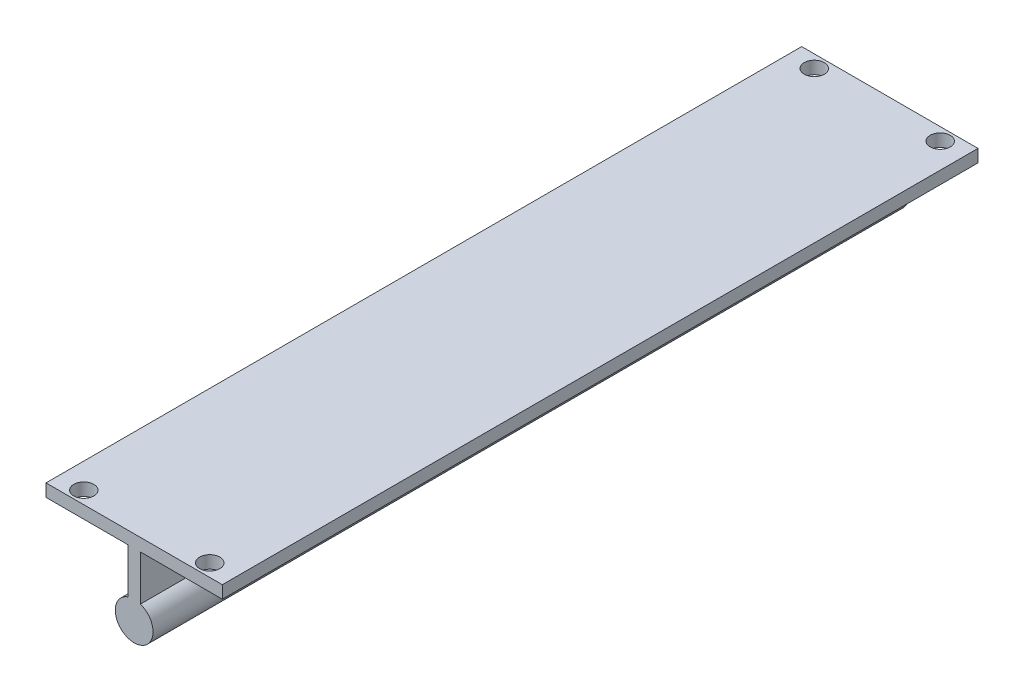
ISO-10303-21;
HEADER;
FILE_DESCRIPTION(('STEP AP214'),'2;1');
FILE_NAME('part.step','',(''),(''),'','','');
FILE_SCHEMA(('AUTOMOTIVE_DESIGN { 1 0 10303 214 1 1 1 1 }'));
ENDSEC;
DATA;
#1=APPLICATION_CONTEXT('core data for automotive mechanical design processes');
#2=APPLICATION_PROTOCOL_DEFINITION('international standard','automotive_design',2000,#1);
#3=PRODUCT_CONTEXT('',#1,'mechanical');
#4=PRODUCT('Part','Part','',(#3));
#5=PRODUCT_RELATED_PRODUCT_CATEGORY('part','',(#4));
#6=PRODUCT_DEFINITION_FORMATION('','',#4);
#7=PRODUCT_DEFINITION_CONTEXT('part definition',#1,'design');
#8=PRODUCT_DEFINITION('design','',#6,#7);
#9=PRODUCT_DEFINITION_SHAPE('','',#8);
#10=(LENGTH_UNIT() NAMED_UNIT(*) SI_UNIT(.MILLI.,.METRE.));
#11=(NAMED_UNIT(*) PLANE_ANGLE_UNIT() SI_UNIT($,.RADIAN.));
#12=(NAMED_UNIT(*) SI_UNIT($,.STERADIAN.) SOLID_ANGLE_UNIT());
#13=UNCERTAINTY_MEASURE_WITH_UNIT(LENGTH_MEASURE(1.E-05),#10,'distance_accuracy_value','');
#14=(GEOMETRIC_REPRESENTATION_CONTEXT(3) GLOBAL_UNCERTAINTY_ASSIGNED_CONTEXT((#13)) GLOBAL_UNIT_ASSIGNED_CONTEXT((#10,
#11,#12)) REPRESENTATION_CONTEXT('',''));
#15=CARTESIAN_POINT('',(0.,0.,0.));
#16=DIRECTION('',(0.,0.,1.));
#17=DIRECTION('',(1.,0.,0.));
#18=AXIS2_PLACEMENT_3D('',#15,#16,#17);
#19=CARTESIAN_POINT('',(0.,0.,300.));
#20=DIRECTION('',(0.,0.,-1.));
#21=DIRECTION('',(-1.,0.,0.));
#22=AXIS2_PLACEMENT_3D('',#19,#20,#21);
#23=CYLINDRICAL_SURFACE('',#22,7.5);
#24=CARTESIAN_POINT('',(0.,0.,0.));
#25=DIRECTION('',(0.,0.,1.));
#26=DIRECTION('',(1.,0.,0.));
#27=AXIS2_PLACEMENT_3D('',#24,#25,#26);
#28=CIRCLE('',#27,7.5);
#29=CARTESIAN_POINT('',(-2.5,7.07106781186548,0.));
#30=VERTEX_POINT('',#29);
#31=CARTESIAN_POINT('',(2.5,7.07106781186548,0.));
#32=VERTEX_POINT('',#31);
#33=EDGE_CURVE('E180',#30,#32,#28,.T.);
#34=ORIENTED_EDGE('',*,*,#33,.T.);
#35=DIRECTION('',(0.,0.,-1.));
#36=VECTOR('',#35,1.);
#37=CARTESIAN_POINT('',(2.5,7.07106781186548,300.));
#38=LINE('',#37,#36);
#39=CARTESIAN_POINT('',(2.5,7.07106781186548,300.));
#40=VERTEX_POINT('',#39);
#41=EDGE_CURVE('E177',#32,#40,#38,.F.);
#42=ORIENTED_EDGE('',*,*,#41,.T.);
#43=CARTESIAN_POINT('',(0.,0.,300.));
#44=DIRECTION('',(0.,0.,1.));
#45=DIRECTION('',(1.,0.,0.));
#46=AXIS2_PLACEMENT_3D('',#43,#44,#45);
#47=CIRCLE('',#46,7.5);
#48=CARTESIAN_POINT('',(-2.5,7.07106781186548,300.));
#49=VERTEX_POINT('',#48);
#50=EDGE_CURVE('E48',#49,#40,#47,.T.);
#51=ORIENTED_EDGE('',*,*,#50,.F.);
#52=DIRECTION('',(0.,0.,-1.));
#53=VECTOR('',#52,1.);
#54=CARTESIAN_POINT('',(-2.5,7.07106781186548,300.));
#55=LINE('',#54,#53);
#56=EDGE_CURVE('E173',#49,#30,#55,.T.);
#57=ORIENTED_EDGE('',*,*,#56,.T.);
#58=EDGE_LOOP('',(#34,#42,#51,#57));
#59=FACE_BOUND('',#58,.T.);
#60=ADVANCED_FACE('F39',(#59),#23,.T.);
#61=CARTESIAN_POINT('',(0.,0.,300.));
#62=DIRECTION('',(0.,0.,1.));
#63=DIRECTION('',(1.,0.,0.));
#64=AXIS2_PLACEMENT_3D('',#61,#62,#63);
#65=PLANE('',#64);
#66=DIRECTION('',(0.,1.,0.));
#67=VECTOR('',#66,1.);
#68=CARTESIAN_POINT('',(2.49999999999999,30.,300.));
#69=LINE('',#68,#67);
#70=CARTESIAN_POINT('',(2.49999999999999,25.,300.));
#71=VERTEX_POINT('',#70);
#72=EDGE_CURVE('E117',#40,#71,#69,.T.);
#73=ORIENTED_EDGE('',*,*,#72,.T.);
#74=DIRECTION('',(1.,0.,0.));
#75=VECTOR('',#74,1.);
#76=CARTESIAN_POINT('',(-35.,25.,300.));
#77=LINE('',#76,#75);
#78=CARTESIAN_POINT('',(35.,25.,300.));
#79=VERTEX_POINT('',#78);
#80=EDGE_CURVE('E131',#71,#79,#77,.T.);
#81=ORIENTED_EDGE('',*,*,#80,.T.);
#82=DIRECTION('',(0.,1.,0.));
#83=VECTOR('',#82,1.);
#84=CARTESIAN_POINT('',(35.,25.,300.));
#85=LINE('',#84,#83);
#86=CARTESIAN_POINT('',(35.,30.,300.));
#87=VERTEX_POINT('',#86);
#88=EDGE_CURVE('E124',#79,#87,#85,.T.);
#89=ORIENTED_EDGE('',*,*,#88,.T.);
#90=DIRECTION('',(-1.,0.,0.));
#91=VECTOR('',#90,1.);
#92=CARTESIAN_POINT('',(-2.5,30.,300.));
#93=LINE('',#92,#91);
#94=CARTESIAN_POINT('',(-35.,30.,300.));
#95=VERTEX_POINT('',#94);
#96=EDGE_CURVE('E107',#87,#95,#93,.T.);
#97=ORIENTED_EDGE('',*,*,#96,.T.);
#98=DIRECTION('',(0.,-1.,0.));
#99=VECTOR('',#98,1.);
#100=CARTESIAN_POINT('',(-35.,30.,300.));
#101=LINE('',#100,#99);
#102=CARTESIAN_POINT('',(-35.,25.,300.));
#103=VERTEX_POINT('',#102);
#104=EDGE_CURVE('E134',#95,#103,#101,.T.);
#105=ORIENTED_EDGE('',*,*,#104,.T.);
#106=CARTESIAN_POINT('',(-2.5,25.,300.));
#107=VERTEX_POINT('',#106);
#108=EDGE_CURVE('E127',#103,#107,#77,.T.);
#109=ORIENTED_EDGE('',*,*,#108,.T.);
#110=DIRECTION('',(0.,-1.,0.));
#111=VECTOR('',#110,1.);
#112=CARTESIAN_POINT('',(-2.5,0.,300.));
#113=LINE('',#112,#111);
#114=EDGE_CURVE('E64',#107,#49,#113,.T.);
#115=ORIENTED_EDGE('',*,*,#114,.T.);
#116=ORIENTED_EDGE('',*,*,#50,.T.);
#117=EDGE_LOOP('',(#73,#81,#89,#97,#105,#109,#115,#116));
#118=FACE_BOUND('',#117,.T.);
#119=ADVANCED_FACE('F130',(#118),#65,.T.);
#120=CARTESIAN_POINT('',(0.,0.,0.));
#121=DIRECTION('',(0.,0.,1.));
#122=DIRECTION('',(1.,0.,0.));
#123=AXIS2_PLACEMENT_3D('',#120,#121,#122);
#124=PLANE('',#123);
#125=DIRECTION('',(0.,1.,0.));
#126=VECTOR('',#125,1.);
#127=CARTESIAN_POINT('',(-2.5,0.,0.));
#128=LINE('',#127,#126);
#129=CARTESIAN_POINT('',(-2.5,25.,0.));
#130=VERTEX_POINT('',#129);
#131=EDGE_CURVE('E159',#30,#130,#128,.T.);
#132=ORIENTED_EDGE('',*,*,#131,.T.);
#133=DIRECTION('',(-1.,0.,0.));
#134=VECTOR('',#133,1.);
#135=CARTESIAN_POINT('',(-35.,25.,0.));
#136=LINE('',#135,#134);
#137=CARTESIAN_POINT('',(-35.,25.,0.));
#138=VERTEX_POINT('',#137);
#139=EDGE_CURVE('E213',#130,#138,#136,.T.);
#140=ORIENTED_EDGE('',*,*,#139,.T.);
#141=DIRECTION('',(0.,1.,0.));
#142=VECTOR('',#141,1.);
#143=CARTESIAN_POINT('',(-35.,30.,0.));
#144=LINE('',#143,#142);
#145=CARTESIAN_POINT('',(-35.,30.,0.));
#146=VERTEX_POINT('',#145);
#147=EDGE_CURVE('E150',#138,#146,#144,.T.);
#148=ORIENTED_EDGE('',*,*,#147,.T.);
#149=DIRECTION('',(1.,0.,0.));
#150=VECTOR('',#149,1.);
#151=CARTESIAN_POINT('',(-2.5,30.,0.));
#152=LINE('',#151,#150);
#153=CARTESIAN_POINT('',(35.,30.,0.));
#154=VERTEX_POINT('',#153);
#155=EDGE_CURVE('E166',#146,#154,#152,.T.);
#156=ORIENTED_EDGE('',*,*,#155,.T.);
#157=DIRECTION('',(0.,-1.,0.));
#158=VECTOR('',#157,1.);
#159=CARTESIAN_POINT('',(35.,25.,0.));
#160=LINE('',#159,#158);
#161=CARTESIAN_POINT('',(35.,25.,0.));
#162=VERTEX_POINT('',#161);
#163=EDGE_CURVE('E125',#154,#162,#160,.T.);
#164=ORIENTED_EDGE('',*,*,#163,.T.);
#165=CARTESIAN_POINT('',(2.49999999999999,25.,0.));
#166=VERTEX_POINT('',#165);
#167=EDGE_CURVE('E56',#162,#166,#136,.T.);
#168=ORIENTED_EDGE('',*,*,#167,.T.);
#169=DIRECTION('',(0.,-1.,0.));
#170=VECTOR('',#169,1.);
#171=CARTESIAN_POINT('',(2.49999999999999,30.,0.));
#172=LINE('',#171,#170);
#173=EDGE_CURVE('E163',#166,#32,#172,.T.);
#174=ORIENTED_EDGE('',*,*,#173,.T.);
#175=ORIENTED_EDGE('',*,*,#33,.F.);
#176=EDGE_LOOP('',(#132,#140,#148,#156,#164,#168,#174,#175));
#177=FACE_BOUND('',#176,.T.);
#178=ADVANCED_FACE('F218',(#177),#124,.F.);
#179=CARTESIAN_POINT('',(2.49999999999999,30.,-30.4138126514911));
#180=DIRECTION('',(1.,0.,0.));
#181=DIRECTION('',(0.,1.,0.));
#182=AXIS2_PLACEMENT_3D('',#179,#180,#181);
#183=PLANE('',#182);
#184=DIRECTION('',(0.,0.,-1.));
#185=VECTOR('',#184,1.);
#186=CARTESIAN_POINT('',(2.49999999999999,25.,-30.4138126514911));
#187=LINE('',#186,#185);
#188=EDGE_CURVE('E156',#71,#166,#187,.T.);
#189=ORIENTED_EDGE('',*,*,#188,.F.);
#190=ORIENTED_EDGE('',*,*,#72,.F.);
#191=ORIENTED_EDGE('',*,*,#41,.F.);
#192=ORIENTED_EDGE('',*,*,#173,.F.);
#193=EDGE_LOOP('',(#189,#190,#191,#192));
#194=FACE_BOUND('',#193,.T.);
#195=ADVANCED_FACE('F235',(#194),#183,.T.);
#196=CARTESIAN_POINT('',(-2.5,0.,-30.4138126514911));
#197=DIRECTION('',(-1.,0.,0.));
#198=DIRECTION('',(0.,0.,1.));
#199=AXIS2_PLACEMENT_3D('',#196,#197,#198);
#200=PLANE('',#199);
#201=DIRECTION('',(0.,0.,1.));
#202=VECTOR('',#201,1.);
#203=CARTESIAN_POINT('',(-2.5,25.,-30.4138126514911));
#204=LINE('',#203,#202);
#205=EDGE_CURVE('E11',#130,#107,#204,.T.);
#206=ORIENTED_EDGE('',*,*,#205,.F.);
#207=ORIENTED_EDGE('',*,*,#131,.F.);
#208=ORIENTED_EDGE('',*,*,#56,.F.);
#209=ORIENTED_EDGE('',*,*,#114,.F.);
#210=EDGE_LOOP('',(#206,#207,#208,#209));
#211=FACE_BOUND('',#210,.T.);
#212=ADVANCED_FACE('F229',(#211),#200,.T.);
#213=CARTESIAN_POINT('',(-2.5,30.,-30.4138126514911));
#214=DIRECTION('',(0.,1.,0.));
#215=DIRECTION('',(0.,0.,1.));
#216=AXIS2_PLACEMENT_3D('',#213,#214,#215);
#217=PLANE('',#216);
#218=CARTESIAN_POINT('',(-25.,30.,295.));
#219=DIRECTION('',(0.,1.,0.));
#220=DIRECTION('',(0.,0.,1.));
#221=AXIS2_PLACEMENT_3D('',#218,#219,#220);
#222=CIRCLE('',#221,4.);
#223=CARTESIAN_POINT('',(-25.,30.,299.));
#224=VERTEX_POINT('',#223);
#225=EDGE_CURVE('E135',#224,#224,#222,.T.);
#226=ORIENTED_EDGE('',*,*,#225,.F.);
#227=EDGE_LOOP('',(#226));
#228=FACE_BOUND('',#227,.T.);
#229=CARTESIAN_POINT('',(25.,30.,295.));
#230=DIRECTION('',(0.,1.,0.));
#231=DIRECTION('',(0.,0.,1.));
#232=AXIS2_PLACEMENT_3D('',#229,#230,#231);
#233=CIRCLE('',#232,4.);
#234=CARTESIAN_POINT('',(25.,30.,299.));
#235=VERTEX_POINT('',#234);
#236=EDGE_CURVE('E194',#235,#235,#233,.T.);
#237=ORIENTED_EDGE('',*,*,#236,.F.);
#238=EDGE_LOOP('',(#237));
#239=FACE_BOUND('',#238,.T.);
#240=CARTESIAN_POINT('',(25.,30.,5.00000000000001));
#241=DIRECTION('',(0.,1.,0.));
#242=DIRECTION('',(0.,0.,1.));
#243=AXIS2_PLACEMENT_3D('',#240,#241,#242);
#244=CIRCLE('',#243,4.);
#245=CARTESIAN_POINT('',(25.,30.,9.00000000000001));
#246=VERTEX_POINT('',#245);
#247=EDGE_CURVE('E190',#246,#246,#244,.T.);
#248=ORIENTED_EDGE('',*,*,#247,.F.);
#249=EDGE_LOOP('',(#248));
#250=FACE_BOUND('',#249,.T.);
#251=CARTESIAN_POINT('',(-25.,30.,5.));
#252=DIRECTION('',(0.,1.,0.));
#253=DIRECTION('',(0.,0.,1.));
#254=AXIS2_PLACEMENT_3D('',#251,#252,#253);
#255=CIRCLE('',#254,4.);
#256=CARTESIAN_POINT('',(-25.,30.,9.00000000000001));
#257=VERTEX_POINT('',#256);
#258=EDGE_CURVE('E198',#257,#257,#255,.T.);
#259=ORIENTED_EDGE('',*,*,#258,.F.);
#260=EDGE_LOOP('',(#259));
#261=FACE_BOUND('',#260,.T.);
#262=ORIENTED_EDGE('',*,*,#155,.F.);
#263=DIRECTION('',(0.,0.,1.));
#264=VECTOR('',#263,1.);
#265=CARTESIAN_POINT('',(-35.,30.,-70.178344238091));
#266=LINE('',#265,#264);
#267=EDGE_CURVE('E112',#146,#95,#266,.T.);
#268=ORIENTED_EDGE('',*,*,#267,.T.);
#269=ORIENTED_EDGE('',*,*,#96,.F.);
#270=DIRECTION('',(0.,0.,1.));
#271=VECTOR('',#270,1.);
#272=CARTESIAN_POINT('',(35.,30.,-70.178344238091));
#273=LINE('',#272,#271);
#274=EDGE_CURVE('E110',#154,#87,#273,.T.);
#275=ORIENTED_EDGE('',*,*,#274,.F.);
#276=EDGE_LOOP('',(#262,#268,#269,#275));
#277=FACE_BOUND('',#276,.T.);
#278=ADVANCED_FACE('F109',(#228,#239,#250,#261,#277),#217,.T.);
#279=CARTESIAN_POINT('',(-35.,30.,-70.178344238091));
#280=DIRECTION('',(-1.,0.,0.));
#281=DIRECTION('',(0.,-1.,0.));
#282=AXIS2_PLACEMENT_3D('',#279,#280,#281);
#283=PLANE('',#282);
#284=ORIENTED_EDGE('',*,*,#147,.F.);
#285=DIRECTION('',(0.,0.,1.));
#286=VECTOR('',#285,1.);
#287=CARTESIAN_POINT('',(-35.,25.,-70.178344238091));
#288=LINE('',#287,#286);
#289=EDGE_CURVE('E151',#138,#103,#288,.T.);
#290=ORIENTED_EDGE('',*,*,#289,.T.);
#291=ORIENTED_EDGE('',*,*,#104,.F.);
#292=ORIENTED_EDGE('',*,*,#267,.F.);
#293=EDGE_LOOP('',(#284,#290,#291,#292));
#294=FACE_BOUND('',#293,.T.);
#295=ADVANCED_FACE('F224',(#294),#283,.T.);
#296=CARTESIAN_POINT('',(-35.,25.,-70.178344238091));
#297=DIRECTION('',(0.,-1.,0.));
#298=DIRECTION('',(0.,0.,-1.));
#299=AXIS2_PLACEMENT_3D('',#296,#297,#298);
#300=PLANE('',#299);
#301=CARTESIAN_POINT('',(-25.,25.,295.));
#302=DIRECTION('',(0.,-1.,0.));
#303=DIRECTION('',(0.,0.,-1.));
#304=AXIS2_PLACEMENT_3D('',#301,#302,#303);
#305=CIRCLE('',#304,4.);
#306=CARTESIAN_POINT('',(-25.,25.,299.));
#307=VERTEX_POINT('',#306);
#308=EDGE_CURVE('E42',#307,#307,#305,.T.);
#309=ORIENTED_EDGE('',*,*,#308,.F.);
#310=EDGE_LOOP('',(#309));
#311=FACE_BOUND('',#310,.T.);
#312=CARTESIAN_POINT('',(-25.,25.,5.));
#313=DIRECTION('',(0.,-1.,0.));
#314=DIRECTION('',(0.,0.,-1.));
#315=AXIS2_PLACEMENT_3D('',#312,#313,#314);
#316=CIRCLE('',#315,4.);
#317=CARTESIAN_POINT('',(-25.,25.,9.00000000000001));
#318=VERTEX_POINT('',#317);
#319=EDGE_CURVE('E195',#318,#318,#316,.T.);
#320=ORIENTED_EDGE('',*,*,#319,.F.);
#321=EDGE_LOOP('',(#320));
#322=FACE_BOUND('',#321,.T.);
#323=ORIENTED_EDGE('',*,*,#139,.F.);
#324=ORIENTED_EDGE('',*,*,#205,.T.);
#325=ORIENTED_EDGE('',*,*,#108,.F.);
#326=ORIENTED_EDGE('',*,*,#289,.F.);
#327=EDGE_LOOP('',(#323,#324,#325,#326));
#328=FACE_BOUND('',#327,.T.);
#329=ADVANCED_FACE('F226',(#311,#322,#328),#300,.T.);
#330=CARTESIAN_POINT('',(25.,25.,295.));
#331=DIRECTION('',(0.,-1.,0.));
#332=DIRECTION('',(0.,0.,-1.));
#333=AXIS2_PLACEMENT_3D('',#330,#331,#332);
#334=CIRCLE('',#333,4.);
#335=CARTESIAN_POINT('',(25.,25.,299.));
#336=VERTEX_POINT('',#335);
#337=EDGE_CURVE('E191',#336,#336,#334,.T.);
#338=ORIENTED_EDGE('',*,*,#337,.F.);
#339=EDGE_LOOP('',(#338));
#340=FACE_BOUND('',#339,.T.);
#341=CARTESIAN_POINT('',(25.,25.,5.00000000000001));
#342=DIRECTION('',(0.,-1.,0.));
#343=DIRECTION('',(0.,0.,-1.));
#344=AXIS2_PLACEMENT_3D('',#341,#342,#343);
#345=CIRCLE('',#344,4.);
#346=CARTESIAN_POINT('',(25.,25.,9.00000000000001));
#347=VERTEX_POINT('',#346);
#348=EDGE_CURVE('E186',#347,#347,#345,.T.);
#349=ORIENTED_EDGE('',*,*,#348,.F.);
#350=EDGE_LOOP('',(#349));
#351=FACE_BOUND('',#350,.T.);
#352=ORIENTED_EDGE('',*,*,#80,.F.);
#353=ORIENTED_EDGE('',*,*,#188,.T.);
#354=ORIENTED_EDGE('',*,*,#167,.F.);
#355=DIRECTION('',(0.,0.,1.));
#356=VECTOR('',#355,1.);
#357=CARTESIAN_POINT('',(35.,25.,-70.178344238091));
#358=LINE('',#357,#356);
#359=EDGE_CURVE('E147',#162,#79,#358,.T.);
#360=ORIENTED_EDGE('',*,*,#359,.T.);
#361=EDGE_LOOP('',(#352,#353,#354,#360));
#362=FACE_BOUND('',#361,.T.);
#363=ADVANCED_FACE('F238',(#340,#351,#362),#300,.T.);
#364=CARTESIAN_POINT('',(35.,25.,-70.178344238091));
#365=DIRECTION('',(1.,0.,0.));
#366=DIRECTION('',(0.,0.,-1.));
#367=AXIS2_PLACEMENT_3D('',#364,#365,#366);
#368=PLANE('',#367);
#369=ORIENTED_EDGE('',*,*,#163,.F.);
#370=ORIENTED_EDGE('',*,*,#274,.T.);
#371=ORIENTED_EDGE('',*,*,#88,.F.);
#372=ORIENTED_EDGE('',*,*,#359,.F.);
#373=EDGE_LOOP('',(#369,#370,#371,#372));
#374=FACE_BOUND('',#373,.T.);
#375=ADVANCED_FACE('F122',(#374),#368,.T.);
#376=CARTESIAN_POINT('',(25.,-7.5,5.00000000000001));
#377=DIRECTION('',(0.,1.,0.));
#378=DIRECTION('',(0.,0.,1.));
#379=AXIS2_PLACEMENT_3D('',#376,#377,#378);
#380=CYLINDRICAL_SURFACE('',#379,4.);
#381=CARTESIAN_POINT('',(25.,30.,9.00000000000001));
#382=CARTESIAN_POINT('',(25.,29.9479166666667,9.00000000000001));
#383=CARTESIAN_POINT('',(25.,29.8958333333333,9.00000000000001));
#384=CARTESIAN_POINT('',(25.,29.7916666666667,9.00000000000001));
#385=CARTESIAN_POINT('',(25.,29.7395833333333,9.00000000000001));
#386=CARTESIAN_POINT('',(25.,29.6354166666667,9.00000000000001));
#387=CARTESIAN_POINT('',(25.,29.5833333333333,9.00000000000001));
#388=CARTESIAN_POINT('',(25.,29.4791666666667,9.00000000000001));
#389=CARTESIAN_POINT('',(25.,29.4270833333333,9.00000000000001));
#390=CARTESIAN_POINT('',(25.,29.3229166666667,9.00000000000001));
#391=CARTESIAN_POINT('',(25.,29.2708333333333,9.00000000000001));
#392=CARTESIAN_POINT('',(25.,29.1666666666667,9.00000000000001));
#393=CARTESIAN_POINT('',(25.,29.1145833333333,9.00000000000001));
#394=CARTESIAN_POINT('',(25.,29.0104166666667,9.00000000000001));
#395=CARTESIAN_POINT('',(25.,28.9583333333333,9.00000000000001));
#396=CARTESIAN_POINT('',(25.,28.8541666666667,9.00000000000001));
#397=CARTESIAN_POINT('',(25.,28.8020833333333,9.00000000000001));
#398=CARTESIAN_POINT('',(25.,28.6979166666667,9.00000000000001));
#399=CARTESIAN_POINT('',(25.,28.6458333333333,9.00000000000001));
#400=CARTESIAN_POINT('',(25.,28.5416666666667,9.00000000000001));
#401=CARTESIAN_POINT('',(25.,28.4895833333333,9.00000000000001));
#402=CARTESIAN_POINT('',(25.,28.3854166666667,9.00000000000001));
#403=CARTESIAN_POINT('',(25.,28.3333333333333,9.00000000000001));
#404=CARTESIAN_POINT('',(25.,28.2291666666667,9.00000000000001));
#405=CARTESIAN_POINT('',(25.,28.1770833333333,9.00000000000001));
#406=CARTESIAN_POINT('',(25.,28.0729166666667,9.00000000000001));
#407=CARTESIAN_POINT('',(25.,28.0208333333333,9.00000000000001));
#408=CARTESIAN_POINT('',(25.,27.9166666666667,9.00000000000001));
#409=CARTESIAN_POINT('',(25.,27.8645833333333,9.00000000000001));
#410=CARTESIAN_POINT('',(25.,27.7604166666667,9.00000000000001));
#411=CARTESIAN_POINT('',(25.,27.7083333333333,9.00000000000001));
#412=CARTESIAN_POINT('',(25.,27.6041666666667,9.00000000000001));
#413=CARTESIAN_POINT('',(25.,27.5520833333333,9.00000000000001));
#414=CARTESIAN_POINT('',(25.,27.4479166666667,9.00000000000001));
#415=CARTESIAN_POINT('',(25.,27.3958333333333,9.00000000000001));
#416=CARTESIAN_POINT('',(25.,27.2916666666667,9.00000000000001));
#417=CARTESIAN_POINT('',(25.,27.2395833333333,9.00000000000001));
#418=CARTESIAN_POINT('',(25.,27.1354166666667,9.00000000000001));
#419=CARTESIAN_POINT('',(25.,27.0833333333333,9.00000000000001));
#420=CARTESIAN_POINT('',(25.,26.9791666666667,9.00000000000001));
#421=CARTESIAN_POINT('',(25.,26.9270833333333,9.00000000000001));
#422=CARTESIAN_POINT('',(25.,26.8229166666667,9.00000000000001));
#423=CARTESIAN_POINT('',(25.,26.7708333333333,9.00000000000001));
#424=CARTESIAN_POINT('',(25.,26.6666666666667,9.00000000000001));
#425=CARTESIAN_POINT('',(25.,26.6145833333333,9.00000000000001));
#426=CARTESIAN_POINT('',(25.,26.5104166666667,9.00000000000001));
#427=CARTESIAN_POINT('',(25.,26.4583333333333,9.00000000000001));
#428=CARTESIAN_POINT('',(25.,26.3541666666667,9.00000000000001));
#429=CARTESIAN_POINT('',(25.,26.3020833333333,9.00000000000001));
#430=CARTESIAN_POINT('',(25.,26.1979166666667,9.00000000000001));
#431=CARTESIAN_POINT('',(25.,26.1458333333333,9.00000000000001));
#432=CARTESIAN_POINT('',(25.,26.0416666666667,9.00000000000001));
#433=CARTESIAN_POINT('',(25.,25.9895833333333,9.00000000000001));
#434=CARTESIAN_POINT('',(25.,25.8854166666667,9.00000000000001));
#435=CARTESIAN_POINT('',(25.,25.8333333333333,9.00000000000001));
#436=CARTESIAN_POINT('',(25.,25.7291666666667,9.00000000000001));
#437=CARTESIAN_POINT('',(25.,25.6770833333333,9.00000000000001));
#438=CARTESIAN_POINT('',(25.,25.5729166666667,9.00000000000001));
#439=CARTESIAN_POINT('',(25.,25.5208333333333,9.00000000000001));
#440=CARTESIAN_POINT('',(25.,25.4166666666667,9.00000000000001));
#441=CARTESIAN_POINT('',(25.,25.3645833333333,9.00000000000001));
#442=CARTESIAN_POINT('',(25.,25.2604166666667,9.00000000000001));
#443=CARTESIAN_POINT('',(25.,25.2083333333333,9.00000000000001));
#444=CARTESIAN_POINT('',(25.,25.1041666666667,9.00000000000001));
#445=CARTESIAN_POINT('',(25.,25.0520833333333,9.00000000000001));
#446=CARTESIAN_POINT('',(25.,25.,9.00000000000001));
#447=B_SPLINE_CURVE_WITH_KNOTS('',3,(#381,#382,#383,#384,#385,#386,#387,#388,#389,#390,#391,
#392,#393,#394,#395,#396,#397,#398,#399,#400,#401,#402,#403,#404,#405,#406,#407,#408,#409,#410,
#411,#412,#413,#414,#415,#416,#417,#418,#419,#420,#421,#422,#423,#424,#425,#426,#427,#428,#429,
#430,#431,#432,#433,#434,#435,#436,#437,#438,#439,#440,#441,#442,#443,#444,#445,#446),
.UNSPECIFIED.,.F.,.F.,(4,2,2,2,2,2,2,2,2,2,2,2,2,2,2,2,2,2,2,2,2,2,2,2,2,2,2,2,2,2,2,2,4),(0.,
0.156249999999997,0.3125,0.468750000000004,0.625000000000001,0.781249999999997,
0.937500000000001,1.09375,1.25,1.40625,1.5625,1.71875,1.875,2.03125,2.1875,2.34375000000001,2.5,
2.65625,2.8125,2.96875000000001,3.125,3.28125,3.4375,3.59375000000001,3.75,3.90625,4.0625,
4.21875000000001,4.375,4.53125,4.6875,4.84375000000001,5.),.UNSPECIFIED.);
#448=EDGE_CURVE('BSEAM247',#246,#347,#447,.T.);
#449=ORIENTED_EDGE('',*,*,#247,.T.);
#450=ORIENTED_EDGE('',*,*,#348,.T.);
#451=ORIENTED_EDGE('',*,*,#448,.T.);
#452=ORIENTED_EDGE('',*,*,#448,.F.);
#453=EDGE_LOOP('',(#449,#451,#450,#452));
#454=FACE_BOUND('',#453,.T.);
#455=ADVANCED_FACE('F247',(#454),#380,.F.);
#456=CARTESIAN_POINT('',(25.,-7.5,295.));
#457=DIRECTION('',(0.,1.,0.));
#458=DIRECTION('',(0.,0.,1.));
#459=AXIS2_PLACEMENT_3D('',#456,#457,#458);
#460=CYLINDRICAL_SURFACE('',#459,4.);
#461=CARTESIAN_POINT('',(25.,30.,299.));
#462=CARTESIAN_POINT('',(25.,29.9479166666667,299.));
#463=CARTESIAN_POINT('',(25.,29.8958333333333,299.));
#464=CARTESIAN_POINT('',(25.,29.7916666666667,299.));
#465=CARTESIAN_POINT('',(25.,29.7395833333333,299.));
#466=CARTESIAN_POINT('',(25.,29.6354166666667,299.));
#467=CARTESIAN_POINT('',(25.,29.5833333333333,299.));
#468=CARTESIAN_POINT('',(25.,29.4791666666667,299.));
#469=CARTESIAN_POINT('',(25.,29.4270833333333,299.));
#470=CARTESIAN_POINT('',(25.,29.3229166666667,299.));
#471=CARTESIAN_POINT('',(25.,29.2708333333333,299.));
#472=CARTESIAN_POINT('',(25.,29.1666666666667,299.));
#473=CARTESIAN_POINT('',(25.,29.1145833333333,299.));
#474=CARTESIAN_POINT('',(25.,29.0104166666667,299.));
#475=CARTESIAN_POINT('',(25.,28.9583333333333,299.));
#476=CARTESIAN_POINT('',(25.,28.8541666666667,299.));
#477=CARTESIAN_POINT('',(25.,28.8020833333333,299.));
#478=CARTESIAN_POINT('',(25.,28.6979166666667,299.));
#479=CARTESIAN_POINT('',(25.,28.6458333333333,299.));
#480=CARTESIAN_POINT('',(25.,28.5416666666667,299.));
#481=CARTESIAN_POINT('',(25.,28.4895833333333,299.));
#482=CARTESIAN_POINT('',(25.,28.3854166666667,299.));
#483=CARTESIAN_POINT('',(25.,28.3333333333333,299.));
#484=CARTESIAN_POINT('',(25.,28.2291666666667,299.));
#485=CARTESIAN_POINT('',(25.,28.1770833333333,299.));
#486=CARTESIAN_POINT('',(25.,28.0729166666667,299.));
#487=CARTESIAN_POINT('',(25.,28.0208333333333,299.));
#488=CARTESIAN_POINT('',(25.,27.9166666666667,299.));
#489=CARTESIAN_POINT('',(25.,27.8645833333333,299.));
#490=CARTESIAN_POINT('',(25.,27.7604166666667,299.));
#491=CARTESIAN_POINT('',(25.,27.7083333333333,299.));
#492=CARTESIAN_POINT('',(25.,27.6041666666667,299.));
#493=CARTESIAN_POINT('',(25.,27.5520833333333,299.));
#494=CARTESIAN_POINT('',(25.,27.4479166666667,299.));
#495=CARTESIAN_POINT('',(25.,27.3958333333333,299.));
#496=CARTESIAN_POINT('',(25.,27.2916666666667,299.));
#497=CARTESIAN_POINT('',(25.,27.2395833333333,299.));
#498=CARTESIAN_POINT('',(25.,27.1354166666667,299.));
#499=CARTESIAN_POINT('',(25.,27.0833333333333,299.));
#500=CARTESIAN_POINT('',(25.,26.9791666666667,299.));
#501=CARTESIAN_POINT('',(25.,26.9270833333333,299.));
#502=CARTESIAN_POINT('',(25.,26.8229166666667,299.));
#503=CARTESIAN_POINT('',(25.,26.7708333333333,299.));
#504=CARTESIAN_POINT('',(25.,26.6666666666667,299.));
#505=CARTESIAN_POINT('',(25.,26.6145833333333,299.));
#506=CARTESIAN_POINT('',(25.,26.5104166666667,299.));
#507=CARTESIAN_POINT('',(25.,26.4583333333333,299.));
#508=CARTESIAN_POINT('',(25.,26.3541666666667,299.));
#509=CARTESIAN_POINT('',(25.,26.3020833333333,299.));
#510=CARTESIAN_POINT('',(25.,26.1979166666667,299.));
#511=CARTESIAN_POINT('',(25.,26.1458333333333,299.));
#512=CARTESIAN_POINT('',(25.,26.0416666666667,299.));
#513=CARTESIAN_POINT('',(25.,25.9895833333333,299.));
#514=CARTESIAN_POINT('',(25.,25.8854166666667,299.));
#515=CARTESIAN_POINT('',(25.,25.8333333333333,299.));
#516=CARTESIAN_POINT('',(25.,25.7291666666667,299.));
#517=CARTESIAN_POINT('',(25.,25.6770833333333,299.));
#518=CARTESIAN_POINT('',(25.,25.5729166666667,299.));
#519=CARTESIAN_POINT('',(25.,25.5208333333333,299.));
#520=CARTESIAN_POINT('',(25.,25.4166666666667,299.));
#521=CARTESIAN_POINT('',(25.,25.3645833333333,299.));
#522=CARTESIAN_POINT('',(25.,25.2604166666667,299.));
#523=CARTESIAN_POINT('',(25.,25.2083333333333,299.));
#524=CARTESIAN_POINT('',(25.,25.1041666666667,299.));
#525=CARTESIAN_POINT('',(25.,25.0520833333333,299.));
#526=CARTESIAN_POINT('',(25.,25.,299.));
#527=B_SPLINE_CURVE_WITH_KNOTS('',3,(#461,#462,#463,#464,#465,#466,#467,#468,#469,#470,#471,
#472,#473,#474,#475,#476,#477,#478,#479,#480,#481,#482,#483,#484,#485,#486,#487,#488,#489,#490,
#491,#492,#493,#494,#495,#496,#497,#498,#499,#500,#501,#502,#503,#504,#505,#506,#507,#508,#509,
#510,#511,#512,#513,#514,#515,#516,#517,#518,#519,#520,#521,#522,#523,#524,#525,#526),
.UNSPECIFIED.,.F.,.F.,(4,2,2,2,2,2,2,2,2,2,2,2,2,2,2,2,2,2,2,2,2,2,2,2,2,2,2,2,2,2,2,2,4),(0.,
0.156249999999997,0.3125,0.468750000000004,0.625000000000001,0.781249999999997,
0.937500000000001,1.09375,1.25,1.40625,1.5625,1.71875,1.875,2.03125,2.1875,2.34375000000001,2.5,
2.65625,2.8125,2.96875000000001,3.125,3.28125,3.4375,3.59375000000001,3.75,3.90625,4.0625,
4.21875000000001,4.375,4.53125,4.6875,4.84375000000001,5.),.UNSPECIFIED.);
#528=EDGE_CURVE('BSEAM296',#235,#336,#527,.T.);
#529=ORIENTED_EDGE('',*,*,#236,.T.);
#530=ORIENTED_EDGE('',*,*,#337,.T.);
#531=ORIENTED_EDGE('',*,*,#528,.T.);
#532=ORIENTED_EDGE('',*,*,#528,.F.);
#533=EDGE_LOOP('',(#529,#531,#530,#532));
#534=FACE_BOUND('',#533,.T.);
#535=ADVANCED_FACE('F296',(#534),#460,.F.);
#536=CARTESIAN_POINT('',(-25.,-7.5,5.));
#537=DIRECTION('',(0.,1.,0.));
#538=DIRECTION('',(0.,0.,1.));
#539=AXIS2_PLACEMENT_3D('',#536,#537,#538);
#540=CYLINDRICAL_SURFACE('',#539,4.);
#541=CARTESIAN_POINT('',(-25.,30.,9.00000000000001));
#542=CARTESIAN_POINT('',(-25.,29.9479166666667,9.00000000000001));
#543=CARTESIAN_POINT('',(-25.,29.8958333333333,9.00000000000001));
#544=CARTESIAN_POINT('',(-25.,29.7916666666667,9.00000000000001));
#545=CARTESIAN_POINT('',(-25.,29.7395833333333,9.00000000000001));
#546=CARTESIAN_POINT('',(-25.,29.6354166666667,9.00000000000001));
#547=CARTESIAN_POINT('',(-25.,29.5833333333333,9.00000000000001));
#548=CARTESIAN_POINT('',(-25.,29.4791666666667,9.00000000000001));
#549=CARTESIAN_POINT('',(-25.,29.4270833333333,9.00000000000001));
#550=CARTESIAN_POINT('',(-25.,29.3229166666667,9.00000000000001));
#551=CARTESIAN_POINT('',(-25.,29.2708333333333,9.00000000000001));
#552=CARTESIAN_POINT('',(-25.,29.1666666666667,9.00000000000001));
#553=CARTESIAN_POINT('',(-25.,29.1145833333333,9.00000000000001));
#554=CARTESIAN_POINT('',(-25.,29.0104166666667,9.00000000000001));
#555=CARTESIAN_POINT('',(-25.,28.9583333333333,9.00000000000001));
#556=CARTESIAN_POINT('',(-25.,28.8541666666667,9.00000000000001));
#557=CARTESIAN_POINT('',(-25.,28.8020833333333,9.00000000000001));
#558=CARTESIAN_POINT('',(-25.,28.6979166666667,9.00000000000001));
#559=CARTESIAN_POINT('',(-25.,28.6458333333333,9.00000000000001));
#560=CARTESIAN_POINT('',(-25.,28.5416666666667,9.00000000000001));
#561=CARTESIAN_POINT('',(-25.,28.4895833333333,9.00000000000001));
#562=CARTESIAN_POINT('',(-25.,28.3854166666667,9.00000000000001));
#563=CARTESIAN_POINT('',(-25.,28.3333333333333,9.00000000000001));
#564=CARTESIAN_POINT('',(-25.,28.2291666666667,9.00000000000001));
#565=CARTESIAN_POINT('',(-25.,28.1770833333333,9.00000000000001));
#566=CARTESIAN_POINT('',(-25.,28.0729166666667,9.00000000000001));
#567=CARTESIAN_POINT('',(-25.,28.0208333333333,9.00000000000001));
#568=CARTESIAN_POINT('',(-25.,27.9166666666667,9.00000000000001));
#569=CARTESIAN_POINT('',(-25.,27.8645833333333,9.00000000000001));
#570=CARTESIAN_POINT('',(-25.,27.7604166666667,9.00000000000001));
#571=CARTESIAN_POINT('',(-25.,27.7083333333333,9.00000000000001));
#572=CARTESIAN_POINT('',(-25.,27.6041666666667,9.00000000000001));
#573=CARTESIAN_POINT('',(-25.,27.5520833333333,9.00000000000001));
#574=CARTESIAN_POINT('',(-25.,27.4479166666667,9.00000000000001));
#575=CARTESIAN_POINT('',(-25.,27.3958333333333,9.00000000000001));
#576=CARTESIAN_POINT('',(-25.,27.2916666666667,9.00000000000001));
#577=CARTESIAN_POINT('',(-25.,27.2395833333333,9.00000000000001));
#578=CARTESIAN_POINT('',(-25.,27.1354166666667,9.00000000000001));
#579=CARTESIAN_POINT('',(-25.,27.0833333333333,9.00000000000001));
#580=CARTESIAN_POINT('',(-25.,26.9791666666667,9.00000000000001));
#581=CARTESIAN_POINT('',(-25.,26.9270833333333,9.00000000000001));
#582=CARTESIAN_POINT('',(-25.,26.8229166666667,9.00000000000001));
#583=CARTESIAN_POINT('',(-25.,26.7708333333333,9.00000000000001));
#584=CARTESIAN_POINT('',(-25.,26.6666666666667,9.00000000000001));
#585=CARTESIAN_POINT('',(-25.,26.6145833333333,9.00000000000001));
#586=CARTESIAN_POINT('',(-25.,26.5104166666667,9.00000000000001));
#587=CARTESIAN_POINT('',(-25.,26.4583333333333,9.00000000000001));
#588=CARTESIAN_POINT('',(-25.,26.3541666666667,9.00000000000001));
#589=CARTESIAN_POINT('',(-25.,26.3020833333333,9.00000000000001));
#590=CARTESIAN_POINT('',(-25.,26.1979166666667,9.00000000000001));
#591=CARTESIAN_POINT('',(-25.,26.1458333333333,9.00000000000001));
#592=CARTESIAN_POINT('',(-25.,26.0416666666667,9.00000000000001));
#593=CARTESIAN_POINT('',(-25.,25.9895833333333,9.00000000000001));
#594=CARTESIAN_POINT('',(-25.,25.8854166666667,9.00000000000001));
#595=CARTESIAN_POINT('',(-25.,25.8333333333333,9.00000000000001));
#596=CARTESIAN_POINT('',(-25.,25.7291666666667,9.00000000000001));
#597=CARTESIAN_POINT('',(-25.,25.6770833333333,9.00000000000001));
#598=CARTESIAN_POINT('',(-25.,25.5729166666667,9.00000000000001));
#599=CARTESIAN_POINT('',(-25.,25.5208333333333,9.00000000000001));
#600=CARTESIAN_POINT('',(-25.,25.4166666666667,9.00000000000001));
#601=CARTESIAN_POINT('',(-25.,25.3645833333333,9.00000000000001));
#602=CARTESIAN_POINT('',(-25.,25.2604166666667,9.00000000000001));
#603=CARTESIAN_POINT('',(-25.,25.2083333333333,9.00000000000001));
#604=CARTESIAN_POINT('',(-25.,25.1041666666667,9.00000000000001));
#605=CARTESIAN_POINT('',(-25.,25.0520833333333,9.00000000000001));
#606=CARTESIAN_POINT('',(-25.,25.,9.00000000000001));
#607=B_SPLINE_CURVE_WITH_KNOTS('',3,(#541,#542,#543,#544,#545,#546,#547,#548,#549,#550,#551,
#552,#553,#554,#555,#556,#557,#558,#559,#560,#561,#562,#563,#564,#565,#566,#567,#568,#569,#570,
#571,#572,#573,#574,#575,#576,#577,#578,#579,#580,#581,#582,#583,#584,#585,#586,#587,#588,#589,
#590,#591,#592,#593,#594,#595,#596,#597,#598,#599,#600,#601,#602,#603,#604,#605,#606),
.UNSPECIFIED.,.F.,.F.,(4,2,2,2,2,2,2,2,2,2,2,2,2,2,2,2,2,2,2,2,2,2,2,2,2,2,2,2,2,2,2,2,4),(0.,
0.156249999999997,0.3125,0.468750000000004,0.625000000000001,0.781249999999997,
0.937500000000001,1.09375,1.25,1.40625,1.5625,1.71875,1.875,2.03125,2.1875,2.34375000000001,2.5,
2.65625,2.8125,2.96875000000001,3.125,3.28125,3.4375,3.59375000000001,3.75,3.90625,4.0625,
4.21875000000001,4.375,4.53125,4.6875,4.84375000000001,5.),.UNSPECIFIED.);
#608=EDGE_CURVE('BSEAM306',#257,#318,#607,.T.);
#609=ORIENTED_EDGE('',*,*,#258,.T.);
#610=ORIENTED_EDGE('',*,*,#319,.T.);
#611=ORIENTED_EDGE('',*,*,#608,.T.);
#612=ORIENTED_EDGE('',*,*,#608,.F.);
#613=EDGE_LOOP('',(#609,#611,#610,#612));
#614=FACE_BOUND('',#613,.T.);
#615=ADVANCED_FACE('F306',(#614),#540,.F.);
#616=CARTESIAN_POINT('',(-25.,-7.5,295.));
#617=DIRECTION('',(0.,1.,0.));
#618=DIRECTION('',(0.,0.,1.));
#619=AXIS2_PLACEMENT_3D('',#616,#617,#618);
#620=CYLINDRICAL_SURFACE('',#619,4.);
#621=CARTESIAN_POINT('',(-25.,30.,299.));
#622=CARTESIAN_POINT('',(-25.,29.9479166666667,299.));
#623=CARTESIAN_POINT('',(-25.,29.8958333333333,299.));
#624=CARTESIAN_POINT('',(-25.,29.7916666666667,299.));
#625=CARTESIAN_POINT('',(-25.,29.7395833333333,299.));
#626=CARTESIAN_POINT('',(-25.,29.6354166666667,299.));
#627=CARTESIAN_POINT('',(-25.,29.5833333333333,299.));
#628=CARTESIAN_POINT('',(-25.,29.4791666666667,299.));
#629=CARTESIAN_POINT('',(-25.,29.4270833333333,299.));
#630=CARTESIAN_POINT('',(-25.,29.3229166666667,299.));
#631=CARTESIAN_POINT('',(-25.,29.2708333333333,299.));
#632=CARTESIAN_POINT('',(-25.,29.1666666666667,299.));
#633=CARTESIAN_POINT('',(-25.,29.1145833333333,299.));
#634=CARTESIAN_POINT('',(-25.,29.0104166666667,299.));
#635=CARTESIAN_POINT('',(-25.,28.9583333333333,299.));
#636=CARTESIAN_POINT('',(-25.,28.8541666666667,299.));
#637=CARTESIAN_POINT('',(-25.,28.8020833333333,299.));
#638=CARTESIAN_POINT('',(-25.,28.6979166666667,299.));
#639=CARTESIAN_POINT('',(-25.,28.6458333333333,299.));
#640=CARTESIAN_POINT('',(-25.,28.5416666666667,299.));
#641=CARTESIAN_POINT('',(-25.,28.4895833333333,299.));
#642=CARTESIAN_POINT('',(-25.,28.3854166666667,299.));
#643=CARTESIAN_POINT('',(-25.,28.3333333333333,299.));
#644=CARTESIAN_POINT('',(-25.,28.2291666666667,299.));
#645=CARTESIAN_POINT('',(-25.,28.1770833333333,299.));
#646=CARTESIAN_POINT('',(-25.,28.0729166666667,299.));
#647=CARTESIAN_POINT('',(-25.,28.0208333333333,299.));
#648=CARTESIAN_POINT('',(-25.,27.9166666666667,299.));
#649=CARTESIAN_POINT('',(-25.,27.8645833333333,299.));
#650=CARTESIAN_POINT('',(-25.,27.7604166666667,299.));
#651=CARTESIAN_POINT('',(-25.,27.7083333333333,299.));
#652=CARTESIAN_POINT('',(-25.,27.6041666666667,299.));
#653=CARTESIAN_POINT('',(-25.,27.5520833333333,299.));
#654=CARTESIAN_POINT('',(-25.,27.4479166666667,299.));
#655=CARTESIAN_POINT('',(-25.,27.3958333333333,299.));
#656=CARTESIAN_POINT('',(-25.,27.2916666666667,299.));
#657=CARTESIAN_POINT('',(-25.,27.2395833333333,299.));
#658=CARTESIAN_POINT('',(-25.,27.1354166666667,299.));
#659=CARTESIAN_POINT('',(-25.,27.0833333333333,299.));
#660=CARTESIAN_POINT('',(-25.,26.9791666666667,299.));
#661=CARTESIAN_POINT('',(-25.,26.9270833333333,299.));
#662=CARTESIAN_POINT('',(-25.,26.8229166666667,299.));
#663=CARTESIAN_POINT('',(-25.,26.7708333333333,299.));
#664=CARTESIAN_POINT('',(-25.,26.6666666666667,299.));
#665=CARTESIAN_POINT('',(-25.,26.6145833333333,299.));
#666=CARTESIAN_POINT('',(-25.,26.5104166666667,299.));
#667=CARTESIAN_POINT('',(-25.,26.4583333333333,299.));
#668=CARTESIAN_POINT('',(-25.,26.3541666666667,299.));
#669=CARTESIAN_POINT('',(-25.,26.3020833333333,299.));
#670=CARTESIAN_POINT('',(-25.,26.1979166666667,299.));
#671=CARTESIAN_POINT('',(-25.,26.1458333333333,299.));
#672=CARTESIAN_POINT('',(-25.,26.0416666666667,299.));
#673=CARTESIAN_POINT('',(-25.,25.9895833333333,299.));
#674=CARTESIAN_POINT('',(-25.,25.8854166666667,299.));
#675=CARTESIAN_POINT('',(-25.,25.8333333333333,299.));
#676=CARTESIAN_POINT('',(-25.,25.7291666666667,299.));
#677=CARTESIAN_POINT('',(-25.,25.6770833333333,299.));
#678=CARTESIAN_POINT('',(-25.,25.5729166666667,299.));
#679=CARTESIAN_POINT('',(-25.,25.5208333333333,299.));
#680=CARTESIAN_POINT('',(-25.,25.4166666666667,299.));
#681=CARTESIAN_POINT('',(-25.,25.3645833333333,299.));
#682=CARTESIAN_POINT('',(-25.,25.2604166666667,299.));
#683=CARTESIAN_POINT('',(-25.,25.2083333333333,299.));
#684=CARTESIAN_POINT('',(-25.,25.1041666666667,299.));
#685=CARTESIAN_POINT('',(-25.,25.0520833333333,299.));
#686=CARTESIAN_POINT('',(-25.,25.,299.));
#687=B_SPLINE_CURVE_WITH_KNOTS('',3,(#621,#622,#623,#624,#625,#626,#627,#628,#629,#630,#631,
#632,#633,#634,#635,#636,#637,#638,#639,#640,#641,#642,#643,#644,#645,#646,#647,#648,#649,#650,
#651,#652,#653,#654,#655,#656,#657,#658,#659,#660,#661,#662,#663,#664,#665,#666,#667,#668,#669,
#670,#671,#672,#673,#674,#675,#676,#677,#678,#679,#680,#681,#682,#683,#684,#685,#686),
.UNSPECIFIED.,.F.,.F.,(4,2,2,2,2,2,2,2,2,2,2,2,2,2,2,2,2,2,2,2,2,2,2,2,2,2,2,2,2,2,2,2,4),(0.,
0.156249999999997,0.3125,0.468750000000004,0.625000000000001,0.781249999999997,
0.937500000000001,1.09375,1.25,1.40625,1.5625,1.71875,1.875,2.03125,2.1875,2.34375000000001,2.5,
2.65625,2.8125,2.96875000000001,3.125,3.28125,3.4375,3.59375000000001,3.75,3.90625,4.0625,
4.21875000000001,4.375,4.53125,4.6875,4.84375000000001,5.),.UNSPECIFIED.);
#688=EDGE_CURVE('BSEAM315',#224,#307,#687,.T.);
#689=ORIENTED_EDGE('',*,*,#225,.T.);
#690=ORIENTED_EDGE('',*,*,#308,.T.);
#691=ORIENTED_EDGE('',*,*,#688,.T.);
#692=ORIENTED_EDGE('',*,*,#688,.F.);
#693=EDGE_LOOP('',(#689,#691,#690,#692));
#694=FACE_BOUND('',#693,.T.);
#695=ADVANCED_FACE('F315',(#694),#620,.F.);
#696=CLOSED_SHELL('',(#60,#119,#178,#195,#212,#278,#295,#329,#363,#375,#455,#535,#615,#695));
#697=MANIFOLD_SOLID_BREP('B2',#696);
#698=ADVANCED_BREP_SHAPE_REPRESENTATION('',(#18,#697),#14);
#699=SHAPE_DEFINITION_REPRESENTATION(#9,#698);
ENDSEC;
END-ISO-10303-21;
